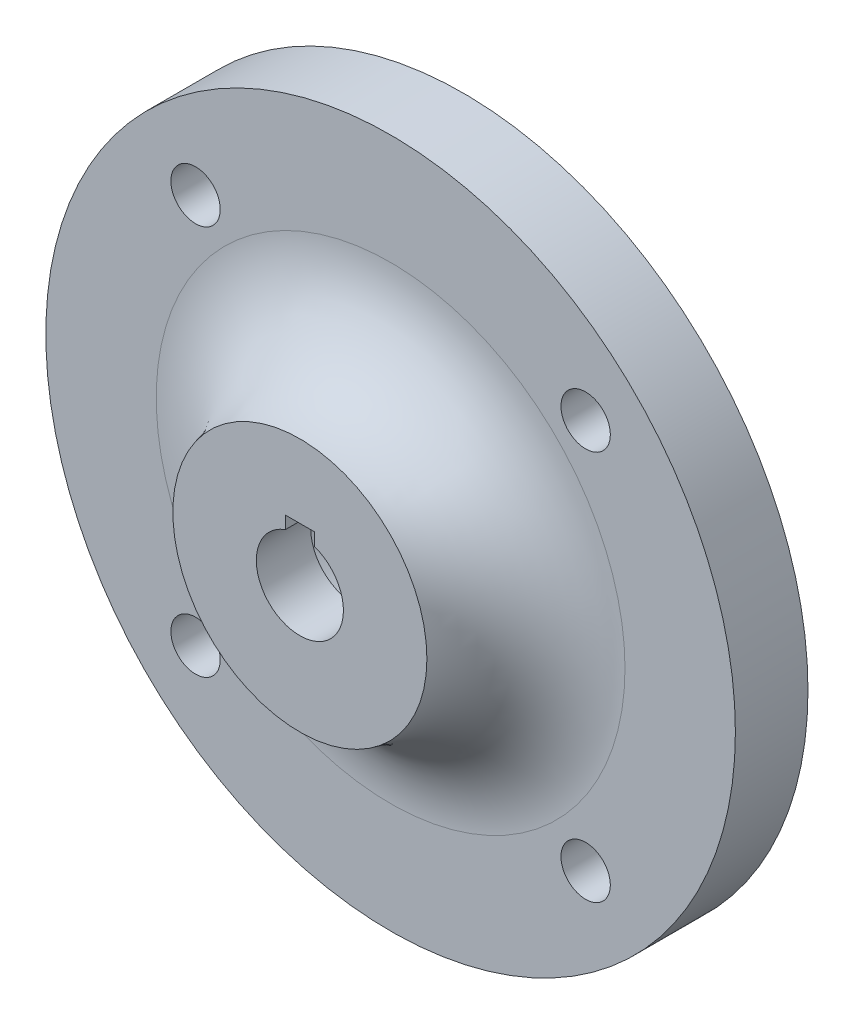
ISO-10303-21;
HEADER;
FILE_DESCRIPTION(('STEP AP214'),'2;1');
FILE_NAME('part.step','',(''),(''),'','','');
FILE_SCHEMA(('AUTOMOTIVE_DESIGN { 1 0 10303 214 1 1 1 1 }'));
ENDSEC;
DATA;
#1=APPLICATION_CONTEXT('core data for automotive mechanical design processes');
#2=APPLICATION_PROTOCOL_DEFINITION('international standard','automotive_design',2000,#1);
#3=PRODUCT_CONTEXT('',#1,'mechanical');
#4=PRODUCT('Part','Part','',(#3));
#5=PRODUCT_RELATED_PRODUCT_CATEGORY('part','',(#4));
#6=PRODUCT_DEFINITION_FORMATION('','',#4);
#7=PRODUCT_DEFINITION_CONTEXT('part definition',#1,'design');
#8=PRODUCT_DEFINITION('design','',#6,#7);
#9=PRODUCT_DEFINITION_SHAPE('','',#8);
#10=(LENGTH_UNIT() NAMED_UNIT(*) SI_UNIT(.MILLI.,.METRE.));
#11=(NAMED_UNIT(*) PLANE_ANGLE_UNIT() SI_UNIT($,.RADIAN.));
#12=(NAMED_UNIT(*) SI_UNIT($,.STERADIAN.) SOLID_ANGLE_UNIT());
#13=UNCERTAINTY_MEASURE_WITH_UNIT(LENGTH_MEASURE(1.E-05),#10,'distance_accuracy_value','');
#14=(GEOMETRIC_REPRESENTATION_CONTEXT(3) GLOBAL_UNCERTAINTY_ASSIGNED_CONTEXT((#13)) GLOBAL_UNIT_ASSIGNED_CONTEXT((#10,
#11,#12)) REPRESENTATION_CONTEXT('',''));
#15=CARTESIAN_POINT('',(0.,0.,0.));
#16=DIRECTION('',(0.,0.,1.));
#17=DIRECTION('',(1.,0.,0.));
#18=AXIS2_PLACEMENT_3D('',#15,#16,#17);
#19=CARTESIAN_POINT('',(0.,0.,8.99999999999997));
#20=DIRECTION('',(0.,0.,1.));
#21=DIRECTION('',(1.,0.,0.));
#22=AXIS2_PLACEMENT_3D('',#19,#20,#21);
#23=PLANE('',#22);
#24=CARTESIAN_POINT('',(0.,0.,8.99999999999997));
#25=DIRECTION('',(0.,0.,-1.));
#26=DIRECTION('',(-1.,0.,0.));
#27=AXIS2_PLACEMENT_3D('',#24,#25,#26);
#28=CIRCLE('',#27,15.);
#29=CARTESIAN_POINT('',(-15.,0.,8.99999999999997));
#30=VERTEX_POINT('',#29);
#31=EDGE_CURVE('E105',#30,#30,#28,.T.);
#32=ORIENTED_EDGE('',*,*,#31,.F.);
#33=EDGE_LOOP('',(#32));
#34=FACE_BOUND('',#33,.T.);
#35=CARTESIAN_POINT('',(26.8700576850888,26.8700576850888,8.99999999999997));
#36=DIRECTION('',(0.,0.,1.));
#37=DIRECTION('',(1.,0.,0.));
#38=AXIS2_PLACEMENT_3D('',#35,#36,#37);
#39=CIRCLE('',#38,8.);
#40=CARTESIAN_POINT('',(34.8700576850888,26.8700576850888,8.99999999999997));
#41=VERTEX_POINT('',#40);
#42=EDGE_CURVE('E166',#41,#41,#39,.F.);
#43=ORIENTED_EDGE('',*,*,#42,.F.);
#44=EDGE_LOOP('',(#43));
#45=FACE_BOUND('',#44,.T.);
#46=CARTESIAN_POINT('',(-26.8700576850888,-26.8700576850888,8.99999999999997));
#47=DIRECTION('',(0.,0.,1.));
#48=DIRECTION('',(1.,0.,0.));
#49=AXIS2_PLACEMENT_3D('',#46,#47,#48);
#50=CIRCLE('',#49,8.);
#51=CARTESIAN_POINT('',(-18.8700576850888,-26.8700576850888,8.99999999999997));
#52=VERTEX_POINT('',#51);
#53=EDGE_CURVE('E158',#52,#52,#50,.F.);
#54=ORIENTED_EDGE('',*,*,#53,.F.);
#55=EDGE_LOOP('',(#54));
#56=FACE_BOUND('',#55,.T.);
#57=CARTESIAN_POINT('',(0.,0.,8.99999999999997));
#58=DIRECTION('',(0.,0.,1.));
#59=DIRECTION('',(1.,0.,0.));
#60=AXIS2_PLACEMENT_3D('',#57,#58,#59);
#61=CIRCLE('',#60,47.5);
#62=CARTESIAN_POINT('',(47.5,0.,8.99999999999997));
#63=VERTEX_POINT('',#62);
#64=EDGE_CURVE('E154',#63,#63,#61,.T.);
#65=ORIENTED_EDGE('',*,*,#64,.F.);
#66=EDGE_LOOP('',(#65));
#67=FACE_BOUND('',#66,.T.);
#68=CARTESIAN_POINT('',(26.8700576850886,-26.8700576850892,8.99999999999997));
#69=DIRECTION('',(0.,0.,1.));
#70=DIRECTION('',(1.,0.,0.));
#71=AXIS2_PLACEMENT_3D('',#68,#69,#70);
#72=CIRCLE('',#71,8.);
#73=CARTESIAN_POINT('',(34.8700576850886,-26.8700576850892,8.99999999999997));
#74=VERTEX_POINT('',#73);
#75=EDGE_CURVE('E163',#74,#74,#72,.F.);
#76=ORIENTED_EDGE('',*,*,#75,.F.);
#77=EDGE_LOOP('',(#76));
#78=FACE_BOUND('',#77,.T.);
#79=CARTESIAN_POINT('',(-26.8700576850886,26.8700576850892,8.99999999999997));
#80=DIRECTION('',(0.,0.,1.));
#81=DIRECTION('',(1.,0.,0.));
#82=AXIS2_PLACEMENT_3D('',#79,#80,#81);
#83=CIRCLE('',#82,8.);
#84=CARTESIAN_POINT('',(-18.8700576850886,26.8700576850892,8.99999999999997));
#85=VERTEX_POINT('',#84);
#86=EDGE_CURVE('E169',#85,#85,#83,.F.);
#87=ORIENTED_EDGE('',*,*,#86,.F.);
#88=EDGE_LOOP('',(#87));
#89=FACE_BOUND('',#88,.T.);
#90=ADVANCED_FACE('F43',(#34,#45,#56,#67,#78,#89),#23,.F.);
#91=CARTESIAN_POINT('',(0.,0.,19.));
#92=DIRECTION('',(0.,0.,1.));
#93=DIRECTION('',(1.,0.,0.));
#94=AXIS2_PLACEMENT_3D('',#91,#92,#93);
#95=PLANE('',#94);
#96=CARTESIAN_POINT('',(0.,0.,19.));
#97=DIRECTION('',(0.,0.,1.));
#98=DIRECTION('',(1.,0.,0.));
#99=AXIS2_PLACEMENT_3D('',#96,#97,#98);
#100=CIRCLE('',#99,32.290199457749);
#101=CARTESIAN_POINT('',(32.290199457749,0.,19.));
#102=VERTEX_POINT('',#101);
#103=EDGE_CURVE('E172',#102,#102,#100,.F.);
#104=ORIENTED_EDGE('',*,*,#103,.T.);
#105=EDGE_LOOP('',(#104));
#106=FACE_BOUND('',#105,.T.);
#107=CARTESIAN_POINT('',(-26.8700576850888,26.8700576850888,19.));
#108=DIRECTION('',(0.,0.,1.));
#109=DIRECTION('',(1.,0.,0.));
#110=AXIS2_PLACEMENT_3D('',#107,#108,#109);
#111=CIRCLE('',#110,3.4);
#112=CARTESIAN_POINT('',(-23.4700576850888,26.8700576850888,19.));
#113=VERTEX_POINT('',#112);
#114=EDGE_CURVE('E145',#113,#113,#111,.T.);
#115=ORIENTED_EDGE('',*,*,#114,.F.);
#116=EDGE_LOOP('',(#115));
#117=FACE_BOUND('',#116,.T.);
#118=CARTESIAN_POINT('',(26.8700576850888,-26.8700576850888,19.));
#119=DIRECTION('',(0.,0.,1.));
#120=DIRECTION('',(1.,0.,0.));
#121=AXIS2_PLACEMENT_3D('',#118,#119,#120);
#122=CIRCLE('',#121,3.4);
#123=CARTESIAN_POINT('',(30.2700576850888,-26.8700576850888,19.));
#124=VERTEX_POINT('',#123);
#125=EDGE_CURVE('E151',#124,#124,#122,.T.);
#126=ORIENTED_EDGE('',*,*,#125,.F.);
#127=EDGE_LOOP('',(#126));
#128=FACE_BOUND('',#127,.T.);
#129=CARTESIAN_POINT('',(0.,0.,19.));
#130=DIRECTION('',(0.,0.,1.));
#131=DIRECTION('',(1.,0.,0.));
#132=AXIS2_PLACEMENT_3D('',#129,#130,#131);
#133=CIRCLE('',#132,47.5);
#134=CARTESIAN_POINT('',(47.5,0.,19.));
#135=VERTEX_POINT('',#134);
#136=EDGE_CURVE('E155',#135,#135,#133,.T.);
#137=ORIENTED_EDGE('',*,*,#136,.T.);
#138=EDGE_LOOP('',(#137));
#139=FACE_BOUND('',#138,.T.);
#140=CARTESIAN_POINT('',(-26.8700576850888,-26.8700576850888,19.));
#141=DIRECTION('',(0.,0.,1.));
#142=DIRECTION('',(1.,0.,0.));
#143=AXIS2_PLACEMENT_3D('',#140,#141,#142);
#144=CIRCLE('',#143,3.4);
#145=CARTESIAN_POINT('',(-23.4700576850888,-26.8700576850888,19.));
#146=VERTEX_POINT('',#145);
#147=EDGE_CURVE('E148',#146,#146,#144,.T.);
#148=ORIENTED_EDGE('',*,*,#147,.F.);
#149=EDGE_LOOP('',(#148));
#150=FACE_BOUND('',#149,.T.);
#151=CARTESIAN_POINT('',(26.8700576850888,26.8700576850888,19.));
#152=DIRECTION('',(0.,0.,1.));
#153=DIRECTION('',(1.,0.,0.));
#154=AXIS2_PLACEMENT_3D('',#151,#152,#153);
#155=CIRCLE('',#154,3.4);
#156=CARTESIAN_POINT('',(30.2700576850888,26.8700576850888,19.));
#157=VERTEX_POINT('',#156);
#158=EDGE_CURVE('E142',#157,#157,#155,.T.);
#159=ORIENTED_EDGE('',*,*,#158,.F.);
#160=EDGE_LOOP('',(#159));
#161=FACE_BOUND('',#160,.T.);
#162=ADVANCED_FACE('F177',(#106,#117,#128,#139,#150,#161),#95,.T.);
#163=CARTESIAN_POINT('',(0.,0.,19.));
#164=DIRECTION('',(0.,0.,-1.));
#165=DIRECTION('',(-1.,0.,0.));
#166=AXIS2_PLACEMENT_3D('',#163,#164,#165);
#167=CYLINDRICAL_SURFACE('',#166,47.5);
#168=ORIENTED_EDGE('',*,*,#136,.F.);
#169=EDGE_LOOP('',(#168));
#170=FACE_BOUND('',#169,.T.);
#171=ORIENTED_EDGE('',*,*,#64,.T.);
#172=EDGE_LOOP('',(#171));
#173=FACE_BOUND('',#172,.T.);
#174=ADVANCED_FACE('F204',(#170,#173),#167,.T.);
#175=CARTESIAN_POINT('',(26.8700576850888,-26.8700576850888,19.));
#176=DIRECTION('',(0.,0.,-1.));
#177=DIRECTION('',(-1.,0.,0.));
#178=AXIS2_PLACEMENT_3D('',#175,#176,#177);
#179=CYLINDRICAL_SURFACE('',#178,3.4);
#180=ORIENTED_EDGE('',*,*,#125,.T.);
#181=EDGE_LOOP('',(#180));
#182=FACE_BOUND('',#181,.T.);
#183=CARTESIAN_POINT('',(26.8700576850886,-26.8700576850892,7.99999999999997));
#184=DIRECTION('',(0.,0.,-1.));
#185=DIRECTION('',(-1.,0.,0.));
#186=AXIS2_PLACEMENT_3D('',#183,#184,#185);
#187=CIRCLE('',#186,3.4);
#188=CARTESIAN_POINT('',(23.4700576850886,-26.8700576850892,7.99999999999997));
#189=VERTEX_POINT('',#188);
#190=EDGE_CURVE('E133',#189,#189,#187,.T.);
#191=ORIENTED_EDGE('',*,*,#190,.T.);
#192=EDGE_LOOP('',(#191));
#193=FACE_BOUND('',#192,.T.);
#194=ADVANCED_FACE('F210',(#182,#193),#179,.F.);
#195=CARTESIAN_POINT('',(-26.8700576850888,-26.8700576850888,19.));
#196=DIRECTION('',(0.,0.,-1.));
#197=DIRECTION('',(-1.,0.,0.));
#198=AXIS2_PLACEMENT_3D('',#195,#196,#197);
#199=CYLINDRICAL_SURFACE('',#198,3.4);
#200=ORIENTED_EDGE('',*,*,#147,.T.);
#201=EDGE_LOOP('',(#200));
#202=FACE_BOUND('',#201,.T.);
#203=CARTESIAN_POINT('',(-26.8700576850888,-26.8700576850888,7.99999999999997));
#204=DIRECTION('',(0.,0.,-1.));
#205=DIRECTION('',(-1.,0.,0.));
#206=AXIS2_PLACEMENT_3D('',#203,#204,#205);
#207=CIRCLE('',#206,3.4);
#208=CARTESIAN_POINT('',(-30.2700576850888,-26.8700576850888,7.99999999999997));
#209=VERTEX_POINT('',#208);
#210=EDGE_CURVE('E136',#209,#209,#207,.T.);
#211=ORIENTED_EDGE('',*,*,#210,.T.);
#212=EDGE_LOOP('',(#211));
#213=FACE_BOUND('',#212,.T.);
#214=ADVANCED_FACE('F215',(#202,#213),#199,.F.);
#215=CARTESIAN_POINT('',(-26.8700576850888,26.8700576850888,19.));
#216=DIRECTION('',(0.,0.,-1.));
#217=DIRECTION('',(-1.,0.,0.));
#218=AXIS2_PLACEMENT_3D('',#215,#216,#217);
#219=CYLINDRICAL_SURFACE('',#218,3.4);
#220=ORIENTED_EDGE('',*,*,#114,.T.);
#221=EDGE_LOOP('',(#220));
#222=FACE_BOUND('',#221,.T.);
#223=CARTESIAN_POINT('',(-26.8700576850886,26.8700576850892,7.99999999999997));
#224=DIRECTION('',(0.,0.,-1.));
#225=DIRECTION('',(-1.,0.,0.));
#226=AXIS2_PLACEMENT_3D('',#223,#224,#225);
#227=CIRCLE('',#226,3.4);
#228=CARTESIAN_POINT('',(-30.2700576850886,26.8700576850892,7.99999999999997));
#229=VERTEX_POINT('',#228);
#230=EDGE_CURVE('E121',#229,#229,#227,.T.);
#231=ORIENTED_EDGE('',*,*,#230,.T.);
#232=EDGE_LOOP('',(#231));
#233=FACE_BOUND('',#232,.T.);
#234=ADVANCED_FACE('F256',(#222,#233),#219,.F.);
#235=CARTESIAN_POINT('',(26.8700576850888,26.8700576850888,19.));
#236=DIRECTION('',(0.,0.,-1.));
#237=DIRECTION('',(-1.,0.,0.));
#238=AXIS2_PLACEMENT_3D('',#235,#236,#237);
#239=CYLINDRICAL_SURFACE('',#238,3.4);
#240=ORIENTED_EDGE('',*,*,#158,.T.);
#241=EDGE_LOOP('',(#240));
#242=FACE_BOUND('',#241,.T.);
#243=CARTESIAN_POINT('',(26.8700576850888,26.8700576850888,7.99999999999997));
#244=DIRECTION('',(0.,0.,-1.));
#245=DIRECTION('',(-1.,0.,0.));
#246=AXIS2_PLACEMENT_3D('',#243,#244,#245);
#247=CIRCLE('',#246,3.4);
#248=CARTESIAN_POINT('',(23.4700576850888,26.8700576850888,7.99999999999997));
#249=VERTEX_POINT('',#248);
#250=EDGE_CURVE('E127',#249,#249,#247,.T.);
#251=ORIENTED_EDGE('',*,*,#250,.T.);
#252=EDGE_LOOP('',(#251));
#253=FACE_BOUND('',#252,.T.);
#254=ADVANCED_FACE('F249',(#242,#253),#239,.F.);
#255=CARTESIAN_POINT('',(-26.8700576850888,-26.8700576850888,7.99999999999997));
#256=DIRECTION('',(0.,0.,-1.));
#257=DIRECTION('',(-1.,0.,0.));
#258=AXIS2_PLACEMENT_3D('',#255,#256,#257);
#259=PLANE('',#258);
#260=CARTESIAN_POINT('',(-26.8700576850888,-26.8700576850888,7.99999999999997));
#261=DIRECTION('',(0.,0.,-1.));
#262=DIRECTION('',(-1.,0.,0.));
#263=AXIS2_PLACEMENT_3D('',#260,#261,#262);
#264=CIRCLE('',#263,8.);
#265=CARTESIAN_POINT('',(-34.8700576850888,-26.8700576850888,7.99999999999997));
#266=VERTEX_POINT('',#265);
#267=EDGE_CURVE('E139',#266,#266,#264,.T.);
#268=ORIENTED_EDGE('',*,*,#267,.T.);
#269=EDGE_LOOP('',(#268));
#270=FACE_BOUND('',#269,.T.);
#271=ORIENTED_EDGE('',*,*,#210,.F.);
#272=EDGE_LOOP('',(#271));
#273=FACE_BOUND('',#272,.T.);
#274=ADVANCED_FACE('F246',(#270,#273),#259,.T.);
#275=CARTESIAN_POINT('',(-26.8700576850888,-26.8700576850888,7.99999999999997));
#276=DIRECTION('',(0.,0.,1.));
#277=DIRECTION('',(1.,0.,0.));
#278=AXIS2_PLACEMENT_3D('',#275,#276,#277);
#279=CYLINDRICAL_SURFACE('',#278,8.);
#280=ORIENTED_EDGE('',*,*,#267,.F.);
#281=EDGE_LOOP('',(#280));
#282=FACE_BOUND('',#281,.T.);
#283=ORIENTED_EDGE('',*,*,#53,.T.);
#284=EDGE_LOOP('',(#283));
#285=FACE_BOUND('',#284,.T.);
#286=ADVANCED_FACE('F240',(#282,#285),#279,.T.);
#287=CARTESIAN_POINT('',(26.8700576850886,-26.8700576850892,7.99999999999997));
#288=DIRECTION('',(0.,0.,-1.));
#289=DIRECTION('',(-1.,0.,0.));
#290=AXIS2_PLACEMENT_3D('',#287,#288,#289);
#291=PLANE('',#290);
#292=CARTESIAN_POINT('',(26.8700576850886,-26.8700576850892,7.99999999999997));
#293=DIRECTION('',(0.,0.,-1.));
#294=DIRECTION('',(-1.,0.,0.));
#295=AXIS2_PLACEMENT_3D('',#292,#293,#294);
#296=CIRCLE('',#295,8.);
#297=CARTESIAN_POINT('',(18.8700576850886,-26.8700576850892,7.99999999999997));
#298=VERTEX_POINT('',#297);
#299=EDGE_CURVE('E130',#298,#298,#296,.T.);
#300=ORIENTED_EDGE('',*,*,#299,.T.);
#301=EDGE_LOOP('',(#300));
#302=FACE_BOUND('',#301,.T.);
#303=ORIENTED_EDGE('',*,*,#190,.F.);
#304=EDGE_LOOP('',(#303));
#305=FACE_BOUND('',#304,.T.);
#306=ADVANCED_FACE('F230',(#302,#305),#291,.T.);
#307=CARTESIAN_POINT('',(26.8700576850886,-26.8700576850892,7.99999999999997));
#308=DIRECTION('',(0.,0.,1.));
#309=DIRECTION('',(1.,0.,0.));
#310=AXIS2_PLACEMENT_3D('',#307,#308,#309);
#311=CYLINDRICAL_SURFACE('',#310,8.);
#312=ORIENTED_EDGE('',*,*,#299,.F.);
#313=EDGE_LOOP('',(#312));
#314=FACE_BOUND('',#313,.T.);
#315=ORIENTED_EDGE('',*,*,#75,.T.);
#316=EDGE_LOOP('',(#315));
#317=FACE_BOUND('',#316,.T.);
#318=ADVANCED_FACE('F227',(#314,#317),#311,.T.);
#319=CARTESIAN_POINT('',(26.8700576850888,26.8700576850888,7.99999999999997));
#320=DIRECTION('',(0.,0.,-1.));
#321=DIRECTION('',(-1.,0.,0.));
#322=AXIS2_PLACEMENT_3D('',#319,#320,#321);
#323=PLANE('',#322);
#324=CARTESIAN_POINT('',(26.8700576850888,26.8700576850888,7.99999999999997));
#325=DIRECTION('',(0.,0.,-1.));
#326=DIRECTION('',(-1.,0.,0.));
#327=AXIS2_PLACEMENT_3D('',#324,#325,#326);
#328=CIRCLE('',#327,8.);
#329=CARTESIAN_POINT('',(18.8700576850888,26.8700576850888,7.99999999999997));
#330=VERTEX_POINT('',#329);
#331=EDGE_CURVE('E124',#330,#330,#328,.T.);
#332=ORIENTED_EDGE('',*,*,#331,.T.);
#333=EDGE_LOOP('',(#332));
#334=FACE_BOUND('',#333,.T.);
#335=ORIENTED_EDGE('',*,*,#250,.F.);
#336=EDGE_LOOP('',(#335));
#337=FACE_BOUND('',#336,.T.);
#338=ADVANCED_FACE('F229',(#334,#337),#323,.T.);
#339=CARTESIAN_POINT('',(26.8700576850888,26.8700576850888,7.99999999999997));
#340=DIRECTION('',(0.,0.,1.));
#341=DIRECTION('',(1.,0.,0.));
#342=AXIS2_PLACEMENT_3D('',#339,#340,#341);
#343=CYLINDRICAL_SURFACE('',#342,8.);
#344=ORIENTED_EDGE('',*,*,#331,.F.);
#345=EDGE_LOOP('',(#344));
#346=FACE_BOUND('',#345,.T.);
#347=ORIENTED_EDGE('',*,*,#42,.T.);
#348=EDGE_LOOP('',(#347));
#349=FACE_BOUND('',#348,.T.);
#350=ADVANCED_FACE('F237',(#346,#349),#343,.T.);
#351=CARTESIAN_POINT('',(-26.8700576850886,26.8700576850892,7.99999999999997));
#352=DIRECTION('',(0.,0.,-1.));
#353=DIRECTION('',(-1.,0.,0.));
#354=AXIS2_PLACEMENT_3D('',#351,#352,#353);
#355=PLANE('',#354);
#356=CARTESIAN_POINT('',(-26.8700576850886,26.8700576850892,7.99999999999997));
#357=DIRECTION('',(0.,0.,-1.));
#358=DIRECTION('',(-1.,0.,0.));
#359=AXIS2_PLACEMENT_3D('',#356,#357,#358);
#360=CIRCLE('',#359,8.);
#361=CARTESIAN_POINT('',(-34.8700576850886,26.8700576850892,7.99999999999997));
#362=VERTEX_POINT('',#361);
#363=EDGE_CURVE('E118',#362,#362,#360,.T.);
#364=ORIENTED_EDGE('',*,*,#363,.T.);
#365=EDGE_LOOP('',(#364));
#366=FACE_BOUND('',#365,.T.);
#367=ORIENTED_EDGE('',*,*,#230,.F.);
#368=EDGE_LOOP('',(#367));
#369=FACE_BOUND('',#368,.T.);
#370=ADVANCED_FACE('F195',(#366,#369),#355,.T.);
#371=CARTESIAN_POINT('',(-26.8700576850886,26.8700576850892,7.99999999999997));
#372=DIRECTION('',(0.,0.,1.));
#373=DIRECTION('',(1.,0.,0.));
#374=AXIS2_PLACEMENT_3D('',#371,#372,#373);
#375=CYLINDRICAL_SURFACE('',#374,8.);
#376=ORIENTED_EDGE('',*,*,#363,.F.);
#377=EDGE_LOOP('',(#376));
#378=FACE_BOUND('',#377,.T.);
#379=ORIENTED_EDGE('',*,*,#86,.T.);
#380=EDGE_LOOP('',(#379));
#381=FACE_BOUND('',#380,.T.);
#382=ADVANCED_FACE('F186',(#378,#381),#375,.T.);
#383=CARTESIAN_POINT('',(0.,0.,31.5));
#384=DIRECTION('',(0.,0.,1.));
#385=DIRECTION('',(1.,0.,0.));
#386=AXIS2_PLACEMENT_3D('',#383,#384,#385);
#387=PLANE('',#386);
#388=DIRECTION('',(0.,-1.,0.));
#389=VECTOR('',#388,1.);
#390=CARTESIAN_POINT('',(-2.,7.4,31.5));
#391=LINE('',#390,#389);
#392=CARTESIAN_POINT('',(-2.,7.4,31.5));
#393=VERTEX_POINT('',#392);
#394=CARTESIAN_POINT('',(-2.,5.65685424949238,31.5));
#395=VERTEX_POINT('',#394);
#396=EDGE_CURVE('E58',#393,#395,#391,.T.);
#397=ORIENTED_EDGE('',*,*,#396,.F.);
#398=DIRECTION('',(-1.,0.,0.));
#399=VECTOR('',#398,1.);
#400=CARTESIAN_POINT('',(2.,7.4,31.5));
#401=LINE('',#400,#399);
#402=CARTESIAN_POINT('',(2.,7.4,31.5));
#403=VERTEX_POINT('',#402);
#404=EDGE_CURVE('E100',#403,#393,#401,.T.);
#405=ORIENTED_EDGE('',*,*,#404,.F.);
#406=DIRECTION('',(0.,1.,0.));
#407=VECTOR('',#406,1.);
#408=CARTESIAN_POINT('',(2.,7.4,31.5));
#409=LINE('',#408,#407);
#410=CARTESIAN_POINT('',(2.,5.65685424949238,31.5));
#411=VERTEX_POINT('',#410);
#412=EDGE_CURVE('E85',#411,#403,#409,.T.);
#413=ORIENTED_EDGE('',*,*,#412,.F.);
#414=CARTESIAN_POINT('',(0.,0.,31.5));
#415=DIRECTION('',(0.,0.,1.));
#416=DIRECTION('',(1.,0.,0.));
#417=AXIS2_PLACEMENT_3D('',#414,#415,#416);
#418=CIRCLE('',#417,6.);
#419=EDGE_CURVE('E98',#395,#411,#418,.T.);
#420=ORIENTED_EDGE('',*,*,#419,.F.);
#421=EDGE_LOOP('',(#397,#405,#413,#420));
#422=FACE_BOUND('',#421,.T.);
#423=CARTESIAN_POINT('',(0.,0.,31.5));
#424=DIRECTION('',(0.,0.,1.));
#425=DIRECTION('',(1.,0.,0.));
#426=AXIS2_PLACEMENT_3D('',#423,#424,#425);
#427=CIRCLE('',#426,17.5);
#428=CARTESIAN_POINT('',(17.5,0.,31.5));
#429=VERTEX_POINT('',#428);
#430=EDGE_CURVE('E113',#429,#429,#427,.T.);
#431=ORIENTED_EDGE('',*,*,#430,.T.);
#432=EDGE_LOOP('',(#431));
#433=FACE_BOUND('',#432,.T.);
#434=ADVANCED_FACE('F96',(#422,#433),#387,.T.);
#435=CARTESIAN_POINT('',(0.,0.,24.));
#436=DIRECTION('',(0.,0.,-1.));
#437=DIRECTION('',(-1.,0.,0.));
#438=AXIS2_PLACEMENT_3D('',#435,#436,#437);
#439=CYLINDRICAL_SURFACE('',#438,15.);
#440=CARTESIAN_POINT('',(0.,0.,24.));
#441=DIRECTION('',(0.,0.,-1.));
#442=DIRECTION('',(-1.,0.,0.));
#443=AXIS2_PLACEMENT_3D('',#440,#441,#442);
#444=CIRCLE('',#443,15.);
#445=CARTESIAN_POINT('',(-15.,0.,24.));
#446=VERTEX_POINT('',#445);
#447=EDGE_CURVE('E110',#446,#446,#444,.T.);
#448=ORIENTED_EDGE('',*,*,#447,.F.);
#449=EDGE_LOOP('',(#448));
#450=FACE_BOUND('',#449,.T.);
#451=ORIENTED_EDGE('',*,*,#31,.T.);
#452=EDGE_LOOP('',(#451));
#453=FACE_BOUND('',#452,.T.);
#454=ADVANCED_FACE('F185',(#450,#453),#439,.F.);
#455=CARTESIAN_POINT('',(0.,0.,24.));
#456=DIRECTION('',(0.,0.,-1.));
#457=DIRECTION('',(-1.,0.,0.));
#458=AXIS2_PLACEMENT_3D('',#455,#456,#457);
#459=PLANE('',#458);
#460=DIRECTION('',(0.,1.,0.));
#461=VECTOR('',#460,1.);
#462=CARTESIAN_POINT('',(-2.,0.,24.));
#463=LINE('',#462,#461);
#464=CARTESIAN_POINT('',(-2.,5.65685424949238,24.));
#465=VERTEX_POINT('',#464);
#466=CARTESIAN_POINT('',(-2.,7.4,24.));
#467=VERTEX_POINT('',#466);
#468=EDGE_CURVE('E63',#465,#467,#463,.T.);
#469=ORIENTED_EDGE('',*,*,#468,.F.);
#470=CARTESIAN_POINT('',(0.,0.,24.));
#471=DIRECTION('',(0.,0.,-1.));
#472=DIRECTION('',(-1.,0.,0.));
#473=AXIS2_PLACEMENT_3D('',#470,#471,#472);
#474=CIRCLE('',#473,6.);
#475=CARTESIAN_POINT('',(2.,5.65685424949238,24.));
#476=VERTEX_POINT('',#475);
#477=EDGE_CURVE('E103',#476,#465,#474,.T.);
#478=ORIENTED_EDGE('',*,*,#477,.F.);
#479=DIRECTION('',(0.,-1.,0.));
#480=VECTOR('',#479,1.);
#481=CARTESIAN_POINT('',(2.,0.,24.));
#482=LINE('',#481,#480);
#483=CARTESIAN_POINT('',(2.,7.4,24.));
#484=VERTEX_POINT('',#483);
#485=EDGE_CURVE('E88',#484,#476,#482,.T.);
#486=ORIENTED_EDGE('',*,*,#485,.F.);
#487=DIRECTION('',(1.,0.,0.));
#488=VECTOR('',#487,1.);
#489=CARTESIAN_POINT('',(0.,7.4,24.));
#490=LINE('',#489,#488);
#491=EDGE_CURVE('E11',#467,#484,#490,.T.);
#492=ORIENTED_EDGE('',*,*,#491,.F.);
#493=EDGE_LOOP('',(#469,#478,#486,#492));
#494=FACE_BOUND('',#493,.T.);
#495=ORIENTED_EDGE('',*,*,#447,.T.);
#496=EDGE_LOOP('',(#495));
#497=FACE_BOUND('',#496,.T.);
#498=ADVANCED_FACE('F182',(#494,#497),#459,.T.);
#499=CARTESIAN_POINT('',(0.,0.,34.));
#500=DIRECTION('',(0.,0.,1.));
#501=DIRECTION('',(1.,0.,0.));
#502=AXIS2_PLACEMENT_3D('',#499,#500,#501);
#503=TOROIDAL_SURFACE('',#502,32.290199457749,15.);
#504=ORIENTED_EDGE('',*,*,#103,.F.);
#505=EDGE_LOOP('',(#504));
#506=FACE_BOUND('',#505,.T.);
#507=ORIENTED_EDGE('',*,*,#430,.F.);
#508=EDGE_LOOP('',(#507));
#509=FACE_BOUND('',#508,.T.);
#510=ADVANCED_FACE('F45',(#506,#509),#503,.F.);
#511=CARTESIAN_POINT('',(0.,0.,7.99999999999997));
#512=DIRECTION('',(0.,0.,1.));
#513=DIRECTION('',(1.,0.,0.));
#514=AXIS2_PLACEMENT_3D('',#511,#512,#513);
#515=CYLINDRICAL_SURFACE('',#514,6.);
#516=ORIENTED_EDGE('',*,*,#419,.T.);
#517=DIRECTION('',(0.,0.,1.));
#518=VECTOR('',#517,1.);
#519=CARTESIAN_POINT('',(2.,5.65685424949238,7.99999999999997));
#520=LINE('',#519,#518);
#521=EDGE_CURVE('E51',#411,#476,#520,.F.);
#522=ORIENTED_EDGE('',*,*,#521,.T.);
#523=ORIENTED_EDGE('',*,*,#477,.T.);
#524=DIRECTION('',(0.,0.,1.));
#525=VECTOR('',#524,1.);
#526=CARTESIAN_POINT('',(-2.,5.65685424949238,7.99999999999997));
#527=LINE('',#526,#525);
#528=EDGE_CURVE('E93',#465,#395,#527,.T.);
#529=ORIENTED_EDGE('',*,*,#528,.T.);
#530=EDGE_LOOP('',(#516,#522,#523,#529));
#531=FACE_BOUND('',#530,.T.);
#532=ADVANCED_FACE('F102',(#531),#515,.F.);
#533=CARTESIAN_POINT('',(-2.,7.4,7.99999999999997));
#534=DIRECTION('',(-1.,0.,0.));
#535=DIRECTION('',(0.,-1.,0.));
#536=AXIS2_PLACEMENT_3D('',#533,#534,#535);
#537=PLANE('',#536);
#538=ORIENTED_EDGE('',*,*,#468,.T.);
#539=DIRECTION('',(0.,0.,1.));
#540=VECTOR('',#539,1.);
#541=CARTESIAN_POINT('',(-2.,7.4,7.99999999999997));
#542=LINE('',#541,#540);
#543=EDGE_CURVE('E400',#467,#393,#542,.T.);
#544=ORIENTED_EDGE('',*,*,#543,.T.);
#545=ORIENTED_EDGE('',*,*,#396,.T.);
#546=ORIENTED_EDGE('',*,*,#528,.F.);
#547=EDGE_LOOP('',(#538,#544,#545,#546));
#548=FACE_BOUND('',#547,.T.);
#549=ADVANCED_FACE('F369',(#548),#537,.F.);
#550=CARTESIAN_POINT('',(2.,7.4,7.99999999999997));
#551=DIRECTION('',(0.,1.,0.));
#552=DIRECTION('',(0.,0.,1.));
#553=AXIS2_PLACEMENT_3D('',#550,#551,#552);
#554=PLANE('',#553);
#555=ORIENTED_EDGE('',*,*,#491,.T.);
#556=DIRECTION('',(0.,0.,1.));
#557=VECTOR('',#556,1.);
#558=CARTESIAN_POINT('',(2.,7.4,7.99999999999997));
#559=LINE('',#558,#557);
#560=EDGE_CURVE('E399',#484,#403,#559,.T.);
#561=ORIENTED_EDGE('',*,*,#560,.T.);
#562=ORIENTED_EDGE('',*,*,#404,.T.);
#563=ORIENTED_EDGE('',*,*,#543,.F.);
#564=EDGE_LOOP('',(#555,#561,#562,#563));
#565=FACE_BOUND('',#564,.T.);
#566=ADVANCED_FACE('F378',(#565),#554,.F.);
#567=CARTESIAN_POINT('',(2.,7.4,7.99999999999997));
#568=DIRECTION('',(1.,0.,0.));
#569=DIRECTION('',(0.,1.,0.));
#570=AXIS2_PLACEMENT_3D('',#567,#568,#569);
#571=PLANE('',#570);
#572=ORIENTED_EDGE('',*,*,#485,.T.);
#573=ORIENTED_EDGE('',*,*,#521,.F.);
#574=ORIENTED_EDGE('',*,*,#412,.T.);
#575=ORIENTED_EDGE('',*,*,#560,.F.);
#576=EDGE_LOOP('',(#572,#573,#574,#575));
#577=FACE_BOUND('',#576,.T.);
#578=ADVANCED_FACE('F83',(#577),#571,.F.);
#579=CLOSED_SHELL('',(#90,#162,#174,#194,#214,#234,#254,#274,#286,#306,#318,#338,#350,#370,#382,
#434,#454,#498,#510,#532,#549,#566,#578));
#580=MANIFOLD_SOLID_BREP('B2',#579);
#581=ADVANCED_BREP_SHAPE_REPRESENTATION('',(#18,#580),#14);
#582=SHAPE_DEFINITION_REPRESENTATION(#9,#581);
ENDSEC;
END-ISO-10303-21;
